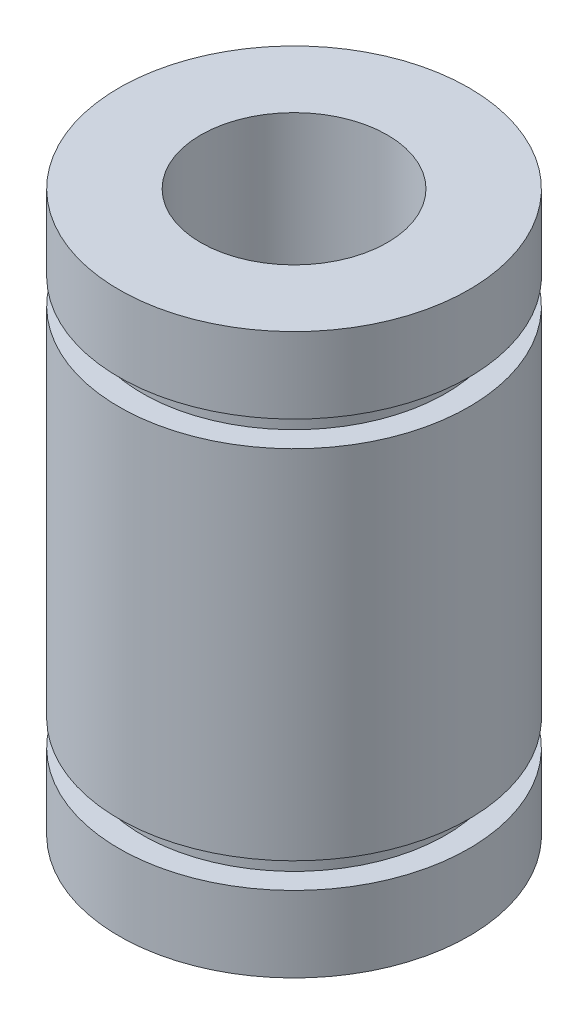
ISO-10303-21;
HEADER;
FILE_DESCRIPTION(('STEP AP214'),'2;1');
FILE_NAME('part.step','',(''),(''),'','','');
FILE_SCHEMA(('AUTOMOTIVE_DESIGN { 1 0 10303 214 1 1 1 1 }'));
ENDSEC;
DATA;
#1=APPLICATION_CONTEXT('core data for automotive mechanical design processes');
#2=APPLICATION_PROTOCOL_DEFINITION('international standard','automotive_design',2000,#1);
#3=PRODUCT_CONTEXT('',#1,'mechanical');
#4=PRODUCT('Part','Part','',(#3));
#5=PRODUCT_RELATED_PRODUCT_CATEGORY('part','',(#4));
#6=PRODUCT_DEFINITION_FORMATION('','',#4);
#7=PRODUCT_DEFINITION_CONTEXT('part definition',#1,'design');
#8=PRODUCT_DEFINITION('design','',#6,#7);
#9=PRODUCT_DEFINITION_SHAPE('','',#8);
#10=(LENGTH_UNIT() NAMED_UNIT(*) SI_UNIT(.MILLI.,.METRE.));
#11=(NAMED_UNIT(*) PLANE_ANGLE_UNIT() SI_UNIT($,.RADIAN.));
#12=(NAMED_UNIT(*) SI_UNIT($,.STERADIAN.) SOLID_ANGLE_UNIT());
#13=UNCERTAINTY_MEASURE_WITH_UNIT(LENGTH_MEASURE(1.E-05),#10,'distance_accuracy_value','');
#14=(GEOMETRIC_REPRESENTATION_CONTEXT(3) GLOBAL_UNCERTAINTY_ASSIGNED_CONTEXT((#13)) GLOBAL_UNIT_ASSIGNED_CONTEXT((#10,
#11,#12)) REPRESENTATION_CONTEXT('',''));
#15=CARTESIAN_POINT('',(0.,0.,0.));
#16=DIRECTION('',(0.,0.,1.));
#17=DIRECTION('',(1.,0.,0.));
#18=AXIS2_PLACEMENT_3D('',#15,#16,#17);
#19=CARTESIAN_POINT('',(0.,0.,0.));
#20=DIRECTION('',(0.,-1.,0.));
#21=DIRECTION('',(0.,0.,-1.));
#22=AXIS2_PLACEMENT_3D('',#19,#20,#21);
#23=CYLINDRICAL_SURFACE('',#22,4.);
#24=CARTESIAN_POINT('',(0.,12.,0.));
#25=DIRECTION('',(0.,-1.,0.));
#26=DIRECTION('',(0.,0.,-1.));
#27=AXIS2_PLACEMENT_3D('',#24,#25,#26);
#28=CIRCLE('',#27,4.);
#29=CARTESIAN_POINT('',(0.,12.,-4.));
#30=VERTEX_POINT('',#29);
#31=EDGE_CURVE('E10',#30,#30,#28,.T.);
#32=ORIENTED_EDGE('',*,*,#31,.F.);
#33=EDGE_LOOP('',(#32));
#34=FACE_BOUND('',#33,.T.);
#35=CARTESIAN_POINT('',(0.,-12.,0.));
#36=DIRECTION('',(0.,-1.,0.));
#37=DIRECTION('',(0.,0.,-1.));
#38=AXIS2_PLACEMENT_3D('',#35,#36,#37);
#39=CIRCLE('',#38,4.);
#40=CARTESIAN_POINT('',(0.,-12.,-4.));
#41=VERTEX_POINT('',#40);
#42=EDGE_CURVE('E55',#41,#41,#39,.T.);
#43=ORIENTED_EDGE('',*,*,#42,.T.);
#44=EDGE_LOOP('',(#43));
#45=FACE_BOUND('',#44,.T.);
#46=ADVANCED_FACE('F30',(#34,#45),#23,.F.);
#47=CARTESIAN_POINT('',(4.,12.,0.));
#48=DIRECTION('',(0.,1.,0.));
#49=DIRECTION('',(0.,0.,1.));
#50=AXIS2_PLACEMENT_3D('',#47,#48,#49);
#51=PLANE('',#50);
#52=ORIENTED_EDGE('',*,*,#31,.T.);
#53=EDGE_LOOP('',(#52));
#54=FACE_BOUND('',#53,.T.);
#55=CARTESIAN_POINT('',(0.,12.,0.));
#56=DIRECTION('',(0.,-1.,0.));
#57=DIRECTION('',(0.,0.,-1.));
#58=AXIS2_PLACEMENT_3D('',#55,#56,#57);
#59=CIRCLE('',#58,7.5);
#60=CARTESIAN_POINT('',(0.,12.,-7.5));
#61=VERTEX_POINT('',#60);
#62=EDGE_CURVE('E36',#61,#61,#59,.T.);
#63=ORIENTED_EDGE('',*,*,#62,.F.);
#64=EDGE_LOOP('',(#63));
#65=FACE_BOUND('',#64,.T.);
#66=ADVANCED_FACE('F93',(#54,#65),#51,.T.);
#67=CARTESIAN_POINT('',(0.,0.,0.));
#68=DIRECTION('',(0.,-1.,0.));
#69=DIRECTION('',(0.,0.,-1.));
#70=AXIS2_PLACEMENT_3D('',#67,#68,#69);
#71=CYLINDRICAL_SURFACE('',#70,7.5);
#72=ORIENTED_EDGE('',*,*,#62,.T.);
#73=EDGE_LOOP('',(#72));
#74=FACE_BOUND('',#73,.T.);
#75=CARTESIAN_POINT('',(0.,8.75,0.));
#76=DIRECTION('',(0.,-1.,0.));
#77=DIRECTION('',(0.,0.,-1.));
#78=AXIS2_PLACEMENT_3D('',#75,#76,#77);
#79=CIRCLE('',#78,7.5);
#80=CARTESIAN_POINT('',(0.,8.75,-7.5));
#81=VERTEX_POINT('',#80);
#82=EDGE_CURVE('E40',#81,#81,#79,.T.);
#83=ORIENTED_EDGE('',*,*,#82,.F.);
#84=EDGE_LOOP('',(#83));
#85=FACE_BOUND('',#84,.T.);
#86=ADVANCED_FACE('F98',(#74,#85),#71,.T.);
#87=CARTESIAN_POINT('',(7.5,8.75,0.));
#88=DIRECTION('',(0.,-1.,0.));
#89=DIRECTION('',(0.,0.,-1.));
#90=AXIS2_PLACEMENT_3D('',#87,#88,#89);
#91=PLANE('',#90);
#92=ORIENTED_EDGE('',*,*,#82,.T.);
#93=EDGE_LOOP('',(#92));
#94=FACE_BOUND('',#93,.T.);
#95=CARTESIAN_POINT('',(0.,8.75,0.));
#96=DIRECTION('',(0.,-1.,0.));
#97=DIRECTION('',(0.,0.,-1.));
#98=AXIS2_PLACEMENT_3D('',#95,#96,#97);
#99=CIRCLE('',#98,6.5);
#100=CARTESIAN_POINT('',(0.,8.75,-6.5));
#101=VERTEX_POINT('',#100);
#102=EDGE_CURVE('E44',#101,#101,#99,.T.);
#103=ORIENTED_EDGE('',*,*,#102,.F.);
#104=EDGE_LOOP('',(#103));
#105=FACE_BOUND('',#104,.T.);
#106=ADVANCED_FACE('F166',(#94,#105),#91,.T.);
#107=CARTESIAN_POINT('',(0.,0.,0.));
#108=DIRECTION('',(0.,-1.,0.));
#109=DIRECTION('',(0.,0.,-1.));
#110=AXIS2_PLACEMENT_3D('',#107,#108,#109);
#111=CYLINDRICAL_SURFACE('',#110,6.5);
#112=ORIENTED_EDGE('',*,*,#102,.T.);
#113=EDGE_LOOP('',(#112));
#114=FACE_BOUND('',#113,.T.);
#115=CARTESIAN_POINT('',(0.,7.65,0.));
#116=DIRECTION('',(0.,-1.,0.));
#117=DIRECTION('',(0.,0.,-1.));
#118=AXIS2_PLACEMENT_3D('',#115,#116,#117);
#119=CIRCLE('',#118,6.5);
#120=CARTESIAN_POINT('',(0.,7.65,-6.5));
#121=VERTEX_POINT('',#120);
#122=EDGE_CURVE('E49',#121,#121,#119,.T.);
#123=ORIENTED_EDGE('',*,*,#122,.F.);
#124=EDGE_LOOP('',(#123));
#125=FACE_BOUND('',#124,.T.);
#126=ADVANCED_FACE('F89',(#114,#125),#111,.T.);
#127=CARTESIAN_POINT('',(6.5,7.65,0.));
#128=DIRECTION('',(0.,1.,0.));
#129=DIRECTION('',(0.,0.,1.));
#130=AXIS2_PLACEMENT_3D('',#127,#128,#129);
#131=PLANE('',#130);
#132=ORIENTED_EDGE('',*,*,#122,.T.);
#133=EDGE_LOOP('',(#132));
#134=FACE_BOUND('',#133,.T.);
#135=CARTESIAN_POINT('',(0.,7.65,0.));
#136=DIRECTION('',(0.,-1.,0.));
#137=DIRECTION('',(0.,0.,-1.));
#138=AXIS2_PLACEMENT_3D('',#135,#136,#137);
#139=CIRCLE('',#138,7.5);
#140=CARTESIAN_POINT('',(0.,7.65,-7.5));
#141=VERTEX_POINT('',#140);
#142=EDGE_CURVE('E52',#141,#141,#139,.T.);
#143=ORIENTED_EDGE('',*,*,#142,.F.);
#144=EDGE_LOOP('',(#143));
#145=FACE_BOUND('',#144,.T.);
#146=ADVANCED_FACE('F79',(#134,#145),#131,.T.);
#147=CARTESIAN_POINT('',(0.,0.,0.));
#148=DIRECTION('',(0.,-1.,0.));
#149=DIRECTION('',(0.,0.,-1.));
#150=AXIS2_PLACEMENT_3D('',#147,#148,#149);
#151=CYLINDRICAL_SURFACE('',#150,7.5);
#152=ORIENTED_EDGE('',*,*,#142,.T.);
#153=EDGE_LOOP('',(#152));
#154=FACE_BOUND('',#153,.T.);
#155=CARTESIAN_POINT('',(0.,-7.65,0.));
#156=DIRECTION('',(0.,-1.,0.));
#157=DIRECTION('',(0.,0.,-1.));
#158=AXIS2_PLACEMENT_3D('',#155,#156,#157);
#159=CIRCLE('',#158,7.5);
#160=CARTESIAN_POINT('',(0.,-7.65,-7.5));
#161=VERTEX_POINT('',#160);
#162=EDGE_CURVE('E70',#161,#161,#159,.T.);
#163=ORIENTED_EDGE('',*,*,#162,.F.);
#164=EDGE_LOOP('',(#163));
#165=FACE_BOUND('',#164,.T.);
#166=ADVANCED_FACE('F76',(#154,#165),#151,.T.);
#167=CARTESIAN_POINT('',(4.,-12.,0.));
#168=DIRECTION('',(0.,-1.,0.));
#169=DIRECTION('',(0.,0.,1.));
#170=AXIS2_PLACEMENT_3D('',#167,#168,#169);
#171=PLANE('',#170);
#172=ORIENTED_EDGE('',*,*,#42,.F.);
#173=EDGE_LOOP('',(#172));
#174=FACE_BOUND('',#173,.T.);
#175=CARTESIAN_POINT('',(0.,-12.,0.));
#176=DIRECTION('',(0.,-1.,0.));
#177=DIRECTION('',(0.,0.,-1.));
#178=AXIS2_PLACEMENT_3D('',#175,#176,#177);
#179=CIRCLE('',#178,7.5);
#180=CARTESIAN_POINT('',(0.,-12.,-7.5));
#181=VERTEX_POINT('',#180);
#182=EDGE_CURVE('E58',#181,#181,#179,.T.);
#183=ORIENTED_EDGE('',*,*,#182,.T.);
#184=EDGE_LOOP('',(#183));
#185=FACE_BOUND('',#184,.T.);
#186=ADVANCED_FACE('F78',(#174,#185),#171,.T.);
#187=CARTESIAN_POINT('',(0.,0.,0.));
#188=DIRECTION('',(0.,1.,0.));
#189=DIRECTION('',(0.,0.,-1.));
#190=AXIS2_PLACEMENT_3D('',#187,#188,#189);
#191=CYLINDRICAL_SURFACE('',#190,7.5);
#192=ORIENTED_EDGE('',*,*,#182,.F.);
#193=EDGE_LOOP('',(#192));
#194=FACE_BOUND('',#193,.T.);
#195=CARTESIAN_POINT('',(0.,-8.75,0.));
#196=DIRECTION('',(0.,-1.,0.));
#197=DIRECTION('',(0.,0.,-1.));
#198=AXIS2_PLACEMENT_3D('',#195,#196,#197);
#199=CIRCLE('',#198,7.5);
#200=CARTESIAN_POINT('',(0.,-8.75,-7.5));
#201=VERTEX_POINT('',#200);
#202=EDGE_CURVE('E61',#201,#201,#199,.T.);
#203=ORIENTED_EDGE('',*,*,#202,.T.);
#204=EDGE_LOOP('',(#203));
#205=FACE_BOUND('',#204,.T.);
#206=ADVANCED_FACE('F86',(#194,#205),#191,.T.);
#207=CARTESIAN_POINT('',(7.5,-8.75,0.));
#208=DIRECTION('',(0.,1.,0.));
#209=DIRECTION('',(0.,0.,-1.));
#210=AXIS2_PLACEMENT_3D('',#207,#208,#209);
#211=PLANE('',#210);
#212=ORIENTED_EDGE('',*,*,#202,.F.);
#213=EDGE_LOOP('',(#212));
#214=FACE_BOUND('',#213,.T.);
#215=CARTESIAN_POINT('',(0.,-8.75,0.));
#216=DIRECTION('',(0.,-1.,0.));
#217=DIRECTION('',(0.,0.,-1.));
#218=AXIS2_PLACEMENT_3D('',#215,#216,#217);
#219=CIRCLE('',#218,6.5);
#220=CARTESIAN_POINT('',(0.,-8.75,-6.5));
#221=VERTEX_POINT('',#220);
#222=EDGE_CURVE('E64',#221,#221,#219,.T.);
#223=ORIENTED_EDGE('',*,*,#222,.T.);
#224=EDGE_LOOP('',(#223));
#225=FACE_BOUND('',#224,.T.);
#226=ADVANCED_FACE('F106',(#214,#225),#211,.T.);
#227=CARTESIAN_POINT('',(0.,0.,0.));
#228=DIRECTION('',(0.,1.,0.));
#229=DIRECTION('',(0.,0.,-1.));
#230=AXIS2_PLACEMENT_3D('',#227,#228,#229);
#231=CYLINDRICAL_SURFACE('',#230,6.5);
#232=ORIENTED_EDGE('',*,*,#222,.F.);
#233=EDGE_LOOP('',(#232));
#234=FACE_BOUND('',#233,.T.);
#235=CARTESIAN_POINT('',(0.,-7.65,0.));
#236=DIRECTION('',(0.,-1.,0.));
#237=DIRECTION('',(0.,0.,-1.));
#238=AXIS2_PLACEMENT_3D('',#235,#236,#237);
#239=CIRCLE('',#238,6.5);
#240=CARTESIAN_POINT('',(0.,-7.65,-6.5));
#241=VERTEX_POINT('',#240);
#242=EDGE_CURVE('E67',#241,#241,#239,.T.);
#243=ORIENTED_EDGE('',*,*,#242,.T.);
#244=EDGE_LOOP('',(#243));
#245=FACE_BOUND('',#244,.T.);
#246=ADVANCED_FACE('F112',(#234,#245),#231,.T.);
#247=CARTESIAN_POINT('',(6.5,-7.65,0.));
#248=DIRECTION('',(0.,-1.,0.));
#249=DIRECTION('',(0.,0.,1.));
#250=AXIS2_PLACEMENT_3D('',#247,#248,#249);
#251=PLANE('',#250);
#252=ORIENTED_EDGE('',*,*,#242,.F.);
#253=EDGE_LOOP('',(#252));
#254=FACE_BOUND('',#253,.T.);
#255=ORIENTED_EDGE('',*,*,#162,.T.);
#256=EDGE_LOOP('',(#255));
#257=FACE_BOUND('',#256,.T.);
#258=ADVANCED_FACE('F74',(#254,#257),#251,.T.);
#259=CLOSED_SHELL('',(#46,#66,#86,#106,#126,#146,#166,#186,#206,#226,#246,#258));
#260=MANIFOLD_SOLID_BREP('B2',#259);
#261=ADVANCED_BREP_SHAPE_REPRESENTATION('',(#18,#260),#14);
#262=SHAPE_DEFINITION_REPRESENTATION(#9,#261);
ENDSEC;
END-ISO-10303-21;
